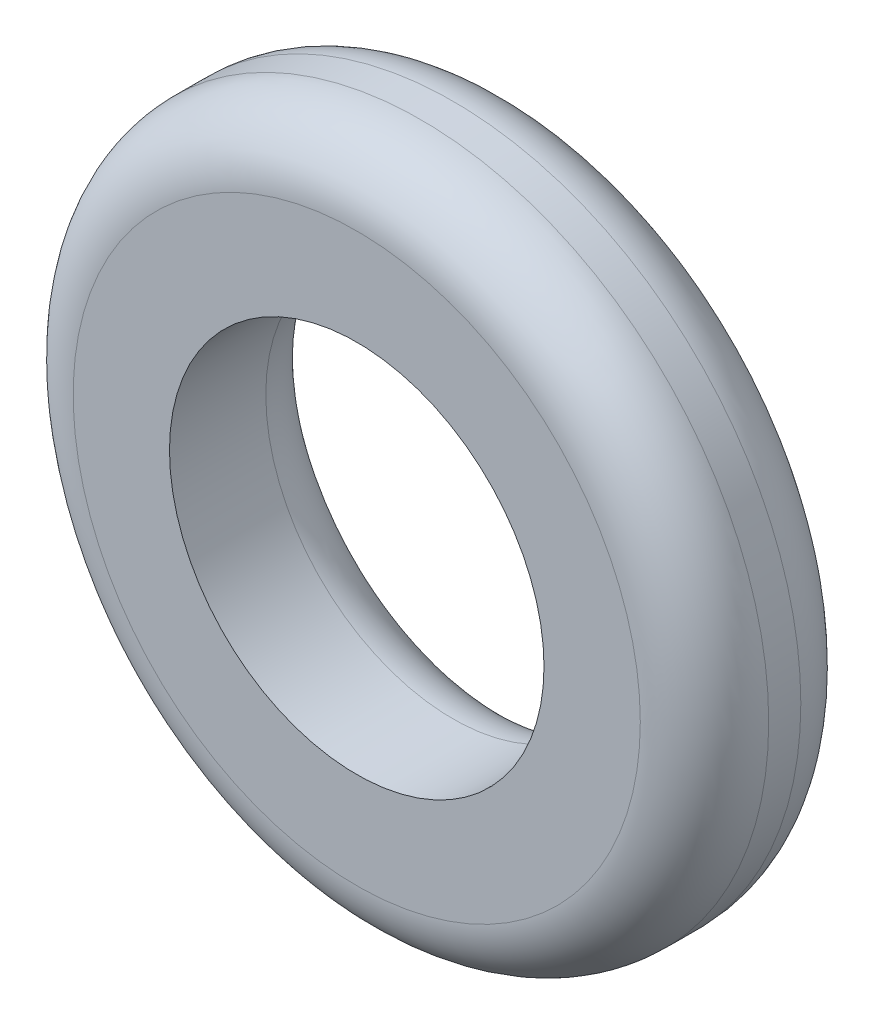
ISO-10303-21;
HEADER;
FILE_DESCRIPTION(('STEP AP214'),'2;1');
FILE_NAME('part.step','',(''),(''),'','','');
FILE_SCHEMA(('AUTOMOTIVE_DESIGN { 1 0 10303 214 1 1 1 1 }'));
ENDSEC;
DATA;
#1=APPLICATION_CONTEXT('core data for automotive mechanical design processes');
#2=APPLICATION_PROTOCOL_DEFINITION('international standard','automotive_design',2000,#1);
#3=PRODUCT_CONTEXT('',#1,'mechanical');
#4=PRODUCT('Part','Part','',(#3));
#5=PRODUCT_RELATED_PRODUCT_CATEGORY('part','',(#4));
#6=PRODUCT_DEFINITION_FORMATION('','',#4);
#7=PRODUCT_DEFINITION_CONTEXT('part definition',#1,'design');
#8=PRODUCT_DEFINITION('design','',#6,#7);
#9=PRODUCT_DEFINITION_SHAPE('','',#8);
#10=(LENGTH_UNIT() NAMED_UNIT(*) SI_UNIT(.MILLI.,.METRE.));
#11=(NAMED_UNIT(*) PLANE_ANGLE_UNIT() SI_UNIT($,.RADIAN.));
#12=(NAMED_UNIT(*) SI_UNIT($,.STERADIAN.) SOLID_ANGLE_UNIT());
#13=UNCERTAINTY_MEASURE_WITH_UNIT(LENGTH_MEASURE(1.E-05),#10,'distance_accuracy_value','');
#14=(GEOMETRIC_REPRESENTATION_CONTEXT(3) GLOBAL_UNCERTAINTY_ASSIGNED_CONTEXT((#13)) GLOBAL_UNIT_ASSIGNED_CONTEXT((#10,
#11,#12)) REPRESENTATION_CONTEXT('',''));
#15=CARTESIAN_POINT('',(0.,0.,0.));
#16=DIRECTION('',(0.,0.,1.));
#17=DIRECTION('',(1.,0.,0.));
#18=AXIS2_PLACEMENT_3D('',#15,#16,#17);
#19=CARTESIAN_POINT('',(0.,0.,1.5));
#20=DIRECTION('',(0.,0.,1.));
#21=DIRECTION('',(1.,0.,0.));
#22=AXIS2_PLACEMENT_3D('',#19,#20,#21);
#23=PLANE('',#22);
#24=CARTESIAN_POINT('',(0.,0.,1.5));
#25=DIRECTION('',(0.,0.,1.));
#26=DIRECTION('',(1.,0.,0.));
#27=AXIS2_PLACEMENT_3D('',#24,#25,#26);
#28=CIRCLE('',#27,2.65);
#29=CARTESIAN_POINT('',(2.65,0.,1.5));
#30=VERTEX_POINT('',#29);
#31=EDGE_CURVE('E42',#30,#30,#28,.T.);
#32=ORIENTED_EDGE('',*,*,#31,.T.);
#33=EDGE_LOOP('',(#32));
#34=FACE_BOUND('',#33,.T.);
#35=CARTESIAN_POINT('',(0.,0.,1.5));
#36=DIRECTION('',(0.,0.,1.));
#37=DIRECTION('',(1.,0.,0.));
#38=AXIS2_PLACEMENT_3D('',#35,#36,#37);
#39=CIRCLE('',#38,1.75);
#40=CARTESIAN_POINT('',(1.75,0.,1.5));
#41=VERTEX_POINT('',#40);
#42=EDGE_CURVE('E57',#41,#41,#39,.T.);
#43=ORIENTED_EDGE('',*,*,#42,.F.);
#44=EDGE_LOOP('',(#43));
#45=FACE_BOUND('',#44,.T.);
#46=ADVANCED_FACE('F31',(#34,#45),#23,.T.);
#47=CARTESIAN_POINT('',(0.,0.,0.));
#48=DIRECTION('',(0.,0.,1.));
#49=DIRECTION('',(1.,0.,0.));
#50=AXIS2_PLACEMENT_3D('',#47,#48,#49);
#51=PLANE('',#50);
#52=CARTESIAN_POINT('',(0.,0.,0.));
#53=DIRECTION('',(0.,0.,1.));
#54=DIRECTION('',(1.,0.,0.));
#55=AXIS2_PLACEMENT_3D('',#52,#53,#54);
#56=CIRCLE('',#55,2.35);
#57=CARTESIAN_POINT('',(2.35,0.,0.));
#58=VERTEX_POINT('',#57);
#59=EDGE_CURVE('E51',#58,#58,#56,.T.);
#60=ORIENTED_EDGE('',*,*,#59,.T.);
#61=EDGE_LOOP('',(#60));
#62=FACE_BOUND('',#61,.T.);
#63=CARTESIAN_POINT('',(0.,0.,0.));
#64=DIRECTION('',(0.,0.,1.));
#65=DIRECTION('',(1.,0.,0.));
#66=AXIS2_PLACEMENT_3D('',#63,#64,#65);
#67=CIRCLE('',#66,2.65);
#68=CARTESIAN_POINT('',(2.65,0.,0.));
#69=VERTEX_POINT('',#68);
#70=EDGE_CURVE('E54',#69,#69,#67,.F.);
#71=ORIENTED_EDGE('',*,*,#70,.T.);
#72=EDGE_LOOP('',(#71));
#73=FACE_BOUND('',#72,.T.);
#74=ADVANCED_FACE('F64',(#62,#73),#51,.F.);
#75=CARTESIAN_POINT('',(0.,0.,1.5));
#76=DIRECTION('',(0.,0.,-1.));
#77=DIRECTION('',(-1.,0.,0.));
#78=AXIS2_PLACEMENT_3D('',#75,#76,#77);
#79=CYLINDRICAL_SURFACE('',#78,3.25);
#80=CARTESIAN_POINT('',(0.,0.,0.9));
#81=DIRECTION('',(0.,0.,1.));
#82=DIRECTION('',(1.,0.,0.));
#83=AXIS2_PLACEMENT_3D('',#80,#81,#82);
#84=CIRCLE('',#83,3.25);
#85=CARTESIAN_POINT('',(3.25,0.,0.9));
#86=VERTEX_POINT('',#85);
#87=EDGE_CURVE('E10',#86,#86,#84,.F.);
#88=ORIENTED_EDGE('',*,*,#87,.T.);
#89=EDGE_LOOP('',(#88));
#90=FACE_BOUND('',#89,.T.);
#91=CARTESIAN_POINT('',(0.,0.,0.6));
#92=DIRECTION('',(0.,0.,1.));
#93=DIRECTION('',(1.,0.,0.));
#94=AXIS2_PLACEMENT_3D('',#91,#92,#93);
#95=CIRCLE('',#94,3.25);
#96=CARTESIAN_POINT('',(3.25,0.,0.6));
#97=VERTEX_POINT('',#96);
#98=EDGE_CURVE('E38',#97,#97,#95,.T.);
#99=ORIENTED_EDGE('',*,*,#98,.T.);
#100=EDGE_LOOP('',(#99));
#101=FACE_BOUND('',#100,.T.);
#102=ADVANCED_FACE('F70',(#90,#101),#79,.T.);
#103=CARTESIAN_POINT('',(0.,0.,1.5));
#104=DIRECTION('',(0.,0.,-1.));
#105=DIRECTION('',(-1.,0.,0.));
#106=AXIS2_PLACEMENT_3D('',#103,#104,#105);
#107=CYLINDRICAL_SURFACE('',#106,1.75);
#108=CARTESIAN_POINT('',(0.,0.,0.6));
#109=DIRECTION('',(0.,0.,1.));
#110=DIRECTION('',(1.,0.,0.));
#111=AXIS2_PLACEMENT_3D('',#108,#109,#110);
#112=CIRCLE('',#111,1.75);
#113=CARTESIAN_POINT('',(1.75,0.,0.6));
#114=VERTEX_POINT('',#113);
#115=EDGE_CURVE('E46',#114,#114,#112,.F.);
#116=ORIENTED_EDGE('',*,*,#115,.T.);
#117=EDGE_LOOP('',(#116));
#118=FACE_BOUND('',#117,.T.);
#119=ORIENTED_EDGE('',*,*,#42,.T.);
#120=EDGE_LOOP('',(#119));
#121=FACE_BOUND('',#120,.T.);
#122=ADVANCED_FACE('F61',(#118,#121),#107,.F.);
#123=CARTESIAN_POINT('',(0.,0.,0.6));
#124=DIRECTION('',(0.,0.,1.));
#125=DIRECTION('',(1.,0.,0.));
#126=AXIS2_PLACEMENT_3D('',#123,#124,#125);
#127=TOROIDAL_SURFACE('',#126,2.35,0.6);
#128=ORIENTED_EDGE('',*,*,#115,.F.);
#129=EDGE_LOOP('',(#128));
#130=FACE_BOUND('',#129,.T.);
#131=ORIENTED_EDGE('',*,*,#59,.F.);
#132=EDGE_LOOP('',(#131));
#133=FACE_BOUND('',#132,.T.);
#134=ADVANCED_FACE('F77',(#130,#133),#127,.T.);
#135=CARTESIAN_POINT('',(0.,0.,0.9));
#136=DIRECTION('',(0.,0.,1.));
#137=DIRECTION('',(1.,0.,0.));
#138=AXIS2_PLACEMENT_3D('',#135,#136,#137);
#139=TOROIDAL_SURFACE('',#138,2.65,0.6);
#140=ORIENTED_EDGE('',*,*,#87,.F.);
#141=EDGE_LOOP('',(#140));
#142=FACE_BOUND('',#141,.T.);
#143=ORIENTED_EDGE('',*,*,#31,.F.);
#144=EDGE_LOOP('',(#143));
#145=FACE_BOUND('',#144,.T.);
#146=ADVANCED_FACE('F79',(#142,#145),#139,.T.);
#147=CARTESIAN_POINT('',(0.,0.,0.6));
#148=DIRECTION('',(0.,0.,1.));
#149=DIRECTION('',(1.,0.,0.));
#150=AXIS2_PLACEMENT_3D('',#147,#148,#149);
#151=TOROIDAL_SURFACE('',#150,2.65,0.6);
#152=ORIENTED_EDGE('',*,*,#70,.F.);
#153=EDGE_LOOP('',(#152));
#154=FACE_BOUND('',#153,.T.);
#155=ORIENTED_EDGE('',*,*,#98,.F.);
#156=EDGE_LOOP('',(#155));
#157=FACE_BOUND('',#156,.T.);
#158=ADVANCED_FACE('F33',(#154,#157),#151,.T.);
#159=CLOSED_SHELL('',(#46,#74,#102,#122,#134,#146,#158));
#160=MANIFOLD_SOLID_BREP('B2',#159);
#161=ADVANCED_BREP_SHAPE_REPRESENTATION('',(#18,#160),#14);
#162=SHAPE_DEFINITION_REPRESENTATION(#9,#161);
ENDSEC;
END-ISO-10303-21;
